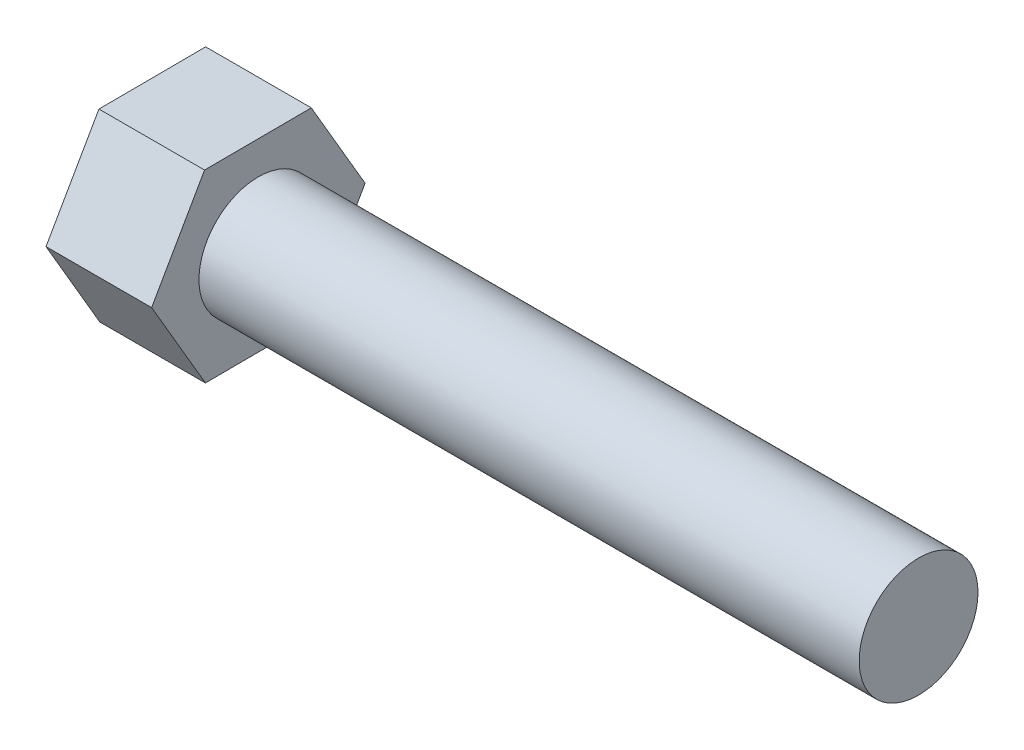
ISO-10303-21;
HEADER;
FILE_DESCRIPTION(('STEP AP214'),'2;1');
FILE_NAME('part.step','',(''),(''),'','','');
FILE_SCHEMA(('AUTOMOTIVE_DESIGN { 1 0 10303 214 1 1 1 1 }'));
ENDSEC;
DATA;
#1=APPLICATION_CONTEXT('core data for automotive mechanical design processes');
#2=APPLICATION_PROTOCOL_DEFINITION('international standard','automotive_design',2000,#1);
#3=PRODUCT_CONTEXT('',#1,'mechanical');
#4=PRODUCT('Part','Part','',(#3));
#5=PRODUCT_RELATED_PRODUCT_CATEGORY('part','',(#4));
#6=PRODUCT_DEFINITION_FORMATION('','',#4);
#7=PRODUCT_DEFINITION_CONTEXT('part definition',#1,'design');
#8=PRODUCT_DEFINITION('design','',#6,#7);
#9=PRODUCT_DEFINITION_SHAPE('','',#8);
#10=(LENGTH_UNIT() NAMED_UNIT(*) SI_UNIT(.MILLI.,.METRE.));
#11=(NAMED_UNIT(*) PLANE_ANGLE_UNIT() SI_UNIT($,.RADIAN.));
#12=(NAMED_UNIT(*) SI_UNIT($,.STERADIAN.) SOLID_ANGLE_UNIT());
#13=UNCERTAINTY_MEASURE_WITH_UNIT(LENGTH_MEASURE(1.E-05),#10,'distance_accuracy_value','');
#14=(GEOMETRIC_REPRESENTATION_CONTEXT(3) GLOBAL_UNCERTAINTY_ASSIGNED_CONTEXT((#13)) GLOBAL_UNIT_ASSIGNED_CONTEXT((#10,
#11,#12)) REPRESENTATION_CONTEXT('',''));
#15=CARTESIAN_POINT('',(0.,0.,0.));
#16=DIRECTION('',(0.,0.,1.));
#17=DIRECTION('',(1.,0.,0.));
#18=AXIS2_PLACEMENT_3D('',#15,#16,#17);
#19=CARTESIAN_POINT('',(4.,-3.50960525079608,2.00399708505724));
#20=DIRECTION('',(0.,0.999988608709094,0.00477309669411459));
#21=DIRECTION('',(0.,-0.00477309669411459,0.999988608709094));
#22=AXIS2_PLACEMENT_3D('',#19,#20,#21);
#23=PLANE('',#22);
#24=DIRECTION('',(0.,0.00477309669411459,-0.999988608709094));
#25=VECTOR('',#24,1.);
#26=CARTESIAN_POINT('',(0.,-3.50960525079608,2.00399708505724));
#27=LINE('',#26,#25);
#28=CARTESIAN_POINT('',(0.,-3.50960525079608,2.00399708505724));
#29=VERTEX_POINT('',#28);
#30=CARTESIAN_POINT('',(0.,-3.49031501016757,-2.03740876191604));
#31=VERTEX_POINT('',#30);
#32=EDGE_CURVE('E123',#29,#31,#27,.T.);
#33=ORIENTED_EDGE('',*,*,#32,.T.);
#34=DIRECTION('',(-1.,0.,0.));
#35=VECTOR('',#34,1.);
#36=CARTESIAN_POINT('',(4.,-3.49031501016757,-2.03740876191604));
#37=LINE('',#36,#35);
#38=CARTESIAN_POINT('',(4.,-3.49031501016757,-2.03740876191604));
#39=VERTEX_POINT('',#38);
#40=EDGE_CURVE('E40',#39,#31,#37,.T.);
#41=ORIENTED_EDGE('',*,*,#40,.F.);
#42=DIRECTION('',(0.,0.00477309669411459,-0.999988608709094));
#43=VECTOR('',#42,1.);
#44=CARTESIAN_POINT('',(4.,-3.50960525079608,2.00399708505724));
#45=LINE('',#44,#43);
#46=CARTESIAN_POINT('',(4.,-3.50960525079608,2.00399708505724));
#47=VERTEX_POINT('',#46);
#48=EDGE_CURVE('E134',#47,#39,#45,.T.);
#49=ORIENTED_EDGE('',*,*,#48,.F.);
#50=DIRECTION('',(-1.,0.,0.));
#51=VECTOR('',#50,1.);
#52=CARTESIAN_POINT('',(4.,-3.50960525079608,2.00399708505724));
#53=LINE('',#52,#51);
#54=EDGE_CURVE('E119',#47,#29,#53,.T.);
#55=ORIENTED_EDGE('',*,*,#54,.T.);
#56=EDGE_LOOP('',(#33,#41,#49,#55));
#57=FACE_BOUND('',#56,.T.);
#58=ADVANCED_FACE('F37',(#57),#23,.F.);
#59=CARTESIAN_POINT('',(4.,-3.49031501016757,-2.03740876191604));
#60=DIRECTION('',(0.,0.495860681362724,0.868402086984189));
#61=DIRECTION('',(0.,-0.868402086984189,0.495860681362724));
#62=AXIS2_PLACEMENT_3D('',#59,#60,#61);
#63=PLANE('',#62);
#64=DIRECTION('',(0.,0.868402086984189,-0.495860681362724));
#65=VECTOR('',#64,1.);
#66=CARTESIAN_POINT('',(0.,-3.49031501016757,-2.03740876191604));
#67=LINE('',#66,#65);
#68=CARTESIAN_POINT('',(0.,0.0192902406285058,-4.04140584697328));
#69=VERTEX_POINT('',#68);
#70=EDGE_CURVE('E126',#31,#69,#67,.T.);
#71=ORIENTED_EDGE('',*,*,#70,.T.);
#72=DIRECTION('',(-1.,0.,0.));
#73=VECTOR('',#72,1.);
#74=CARTESIAN_POINT('',(4.,0.0192902406285058,-4.04140584697328));
#75=LINE('',#74,#73);
#76=CARTESIAN_POINT('',(4.,0.0192902406285058,-4.04140584697328));
#77=VERTEX_POINT('',#76);
#78=EDGE_CURVE('E137',#77,#69,#75,.T.);
#79=ORIENTED_EDGE('',*,*,#78,.F.);
#80=DIRECTION('',(0.,0.868402086984189,-0.495860681362724));
#81=VECTOR('',#80,1.);
#82=CARTESIAN_POINT('',(4.,-3.49031501016757,-2.03740876191604));
#83=LINE('',#82,#81);
#84=EDGE_CURVE('E92',#39,#77,#83,.T.);
#85=ORIENTED_EDGE('',*,*,#84,.F.);
#86=ORIENTED_EDGE('',*,*,#40,.T.);
#87=EDGE_LOOP('',(#71,#79,#85,#86));
#88=FACE_BOUND('',#87,.T.);
#89=ADVANCED_FACE('F142',(#88),#63,.F.);
#90=CARTESIAN_POINT('',(4.,0.0192902406285058,-4.04140584697328));
#91=DIRECTION('',(0.,-0.504127927346369,0.863628990290075));
#92=DIRECTION('',(0.,-0.863628990290075,-0.504127927346369));
#93=AXIS2_PLACEMENT_3D('',#90,#91,#92);
#94=PLANE('',#93);
#95=DIRECTION('',(0.,0.863628990290075,0.504127927346369));
#96=VECTOR('',#95,1.);
#97=CARTESIAN_POINT('',(0.,0.0192902406285058,-4.04140584697328));
#98=LINE('',#97,#96);
#99=CARTESIAN_POINT('',(0.,3.50960525079608,-2.00399708505724));
#100=VERTEX_POINT('',#99);
#101=EDGE_CURVE('E129',#69,#100,#98,.T.);
#102=ORIENTED_EDGE('',*,*,#101,.T.);
#103=DIRECTION('',(-1.,0.,0.));
#104=VECTOR('',#103,1.);
#105=CARTESIAN_POINT('',(4.,3.50960525079608,-2.00399708505724));
#106=LINE('',#105,#104);
#107=CARTESIAN_POINT('',(4.,3.50960525079608,-2.00399708505724));
#108=VERTEX_POINT('',#107);
#109=EDGE_CURVE('E114',#108,#100,#106,.T.);
#110=ORIENTED_EDGE('',*,*,#109,.F.);
#111=DIRECTION('',(0.,0.863628990290075,0.504127927346369));
#112=VECTOR('',#111,1.);
#113=CARTESIAN_POINT('',(4.,0.0192902406285058,-4.04140584697328));
#114=LINE('',#113,#112);
#115=EDGE_CURVE('E105',#77,#108,#114,.T.);
#116=ORIENTED_EDGE('',*,*,#115,.F.);
#117=ORIENTED_EDGE('',*,*,#78,.T.);
#118=EDGE_LOOP('',(#102,#110,#116,#117));
#119=FACE_BOUND('',#118,.T.);
#120=ADVANCED_FACE('F148',(#119),#94,.F.);
#121=CARTESIAN_POINT('',(4.,3.50960525079608,-2.00399708505724));
#122=DIRECTION('',(0.,-0.999988608709094,-0.00477309669411416));
#123=DIRECTION('',(0.,0.00477309669411416,-0.999988608709094));
#124=AXIS2_PLACEMENT_3D('',#121,#122,#123);
#125=PLANE('',#124);
#126=DIRECTION('',(0.,-0.00477309669411416,0.999988608709094));
#127=VECTOR('',#126,1.);
#128=CARTESIAN_POINT('',(0.,3.50960525079608,-2.00399708505724));
#129=LINE('',#128,#127);
#130=CARTESIAN_POINT('',(0.,3.49031501016758,2.03740876191604));
#131=VERTEX_POINT('',#130);
#132=EDGE_CURVE('E113',#100,#131,#129,.T.);
#133=ORIENTED_EDGE('',*,*,#132,.T.);
#134=DIRECTION('',(-1.,0.,0.));
#135=VECTOR('',#134,1.);
#136=CARTESIAN_POINT('',(4.,3.49031501016758,2.03740876191604));
#137=LINE('',#136,#135);
#138=CARTESIAN_POINT('',(4.,3.49031501016758,2.03740876191604));
#139=VERTEX_POINT('',#138);
#140=EDGE_CURVE('E110',#139,#131,#137,.T.);
#141=ORIENTED_EDGE('',*,*,#140,.F.);
#142=DIRECTION('',(0.,-0.00477309669411416,0.999988608709094));
#143=VECTOR('',#142,1.);
#144=CARTESIAN_POINT('',(4.,3.50960525079608,-2.00399708505724));
#145=LINE('',#144,#143);
#146=EDGE_CURVE('E99',#108,#139,#145,.T.);
#147=ORIENTED_EDGE('',*,*,#146,.F.);
#148=ORIENTED_EDGE('',*,*,#109,.T.);
#149=EDGE_LOOP('',(#133,#141,#147,#148));
#150=FACE_BOUND('',#149,.T.);
#151=ADVANCED_FACE('F111',(#150),#125,.F.);
#152=CARTESIAN_POINT('',(4.,3.49031501016758,2.03740876191604));
#153=DIRECTION('',(0.,-0.495860681362724,-0.868402086984189));
#154=DIRECTION('',(0.,0.868402086984189,-0.495860681362724));
#155=AXIS2_PLACEMENT_3D('',#152,#153,#154);
#156=PLANE('',#155);
#157=DIRECTION('',(0.,-0.868402086984189,0.495860681362724));
#158=VECTOR('',#157,1.);
#159=CARTESIAN_POINT('',(0.,3.49031501016758,2.03740876191604));
#160=LINE('',#159,#158);
#161=CARTESIAN_POINT('',(0.,-0.0192902406285045,4.04140584697328));
#162=VERTEX_POINT('',#161);
#163=EDGE_CURVE('E77',#131,#162,#160,.T.);
#164=ORIENTED_EDGE('',*,*,#163,.T.);
#165=DIRECTION('',(-1.,0.,0.));
#166=VECTOR('',#165,1.);
#167=CARTESIAN_POINT('',(4.,-0.0192902406285045,4.04140584697328));
#168=LINE('',#167,#166);
#169=CARTESIAN_POINT('',(4.,-0.0192902406285045,4.04140584697328));
#170=VERTEX_POINT('',#169);
#171=EDGE_CURVE('E115',#170,#162,#168,.T.);
#172=ORIENTED_EDGE('',*,*,#171,.F.);
#173=DIRECTION('',(0.,-0.868402086984189,0.495860681362724));
#174=VECTOR('',#173,1.);
#175=CARTESIAN_POINT('',(4.,3.49031501016758,2.03740876191604));
#176=LINE('',#175,#174);
#177=EDGE_CURVE('E103',#139,#170,#176,.T.);
#178=ORIENTED_EDGE('',*,*,#177,.F.);
#179=ORIENTED_EDGE('',*,*,#140,.T.);
#180=EDGE_LOOP('',(#164,#172,#178,#179));
#181=FACE_BOUND('',#180,.T.);
#182=ADVANCED_FACE('F117',(#181),#156,.F.);
#183=CARTESIAN_POINT('',(4.,-0.0192902406285045,4.04140584697328));
#184=DIRECTION('',(0.,0.504127927346369,-0.863628990290075));
#185=DIRECTION('',(0.,0.863628990290075,0.504127927346369));
#186=AXIS2_PLACEMENT_3D('',#183,#184,#185);
#187=PLANE('',#186);
#188=DIRECTION('',(0.,-0.863628990290075,-0.504127927346369));
#189=VECTOR('',#188,1.);
#190=CARTESIAN_POINT('',(0.,-0.0192902406285045,4.04140584697328));
#191=LINE('',#190,#189);
#192=EDGE_CURVE('E83',#162,#29,#191,.T.);
#193=ORIENTED_EDGE('',*,*,#192,.T.);
#194=ORIENTED_EDGE('',*,*,#54,.F.);
#195=DIRECTION('',(0.,-0.863628990290075,-0.504127927346369));
#196=VECTOR('',#195,1.);
#197=CARTESIAN_POINT('',(4.,-0.0192902406285045,4.04140584697328));
#198=LINE('',#197,#196);
#199=EDGE_CURVE('E54',#170,#47,#198,.T.);
#200=ORIENTED_EDGE('',*,*,#199,.F.);
#201=ORIENTED_EDGE('',*,*,#171,.T.);
#202=EDGE_LOOP('',(#193,#194,#200,#201));
#203=FACE_BOUND('',#202,.T.);
#204=ADVANCED_FACE('F164',(#203),#187,.F.);
#205=CARTESIAN_POINT('',(4.,0.,0.));
#206=DIRECTION('',(1.,0.,0.));
#207=DIRECTION('',(0.,0.,-1.));
#208=AXIS2_PLACEMENT_3D('',#205,#206,#207);
#209=PLANE('',#208);
#210=CARTESIAN_POINT('',(4.,0.,0.));
#211=DIRECTION('',(1.,0.,0.));
#212=DIRECTION('',(0.,0.,-1.));
#213=AXIS2_PLACEMENT_3D('',#210,#211,#212);
#214=CIRCLE('',#213,2.25);
#215=CARTESIAN_POINT('',(4.,0.,-2.25));
#216=VERTEX_POINT('',#215);
#217=EDGE_CURVE('E11',#216,#216,#214,.T.);
#218=ORIENTED_EDGE('',*,*,#217,.F.);
#219=EDGE_LOOP('',(#218));
#220=FACE_BOUND('',#219,.T.);
#221=ORIENTED_EDGE('',*,*,#48,.T.);
#222=ORIENTED_EDGE('',*,*,#84,.T.);
#223=ORIENTED_EDGE('',*,*,#115,.T.);
#224=ORIENTED_EDGE('',*,*,#146,.T.);
#225=ORIENTED_EDGE('',*,*,#177,.T.);
#226=ORIENTED_EDGE('',*,*,#199,.T.);
#227=EDGE_LOOP('',(#221,#222,#223,#224,#225,#226));
#228=FACE_BOUND('',#227,.T.);
#229=ADVANCED_FACE('F101',(#220,#228),#209,.T.);
#230=CARTESIAN_POINT('',(0.,0.,0.));
#231=DIRECTION('',(1.,0.,0.));
#232=DIRECTION('',(0.,0.,-1.));
#233=AXIS2_PLACEMENT_3D('',#230,#231,#232);
#234=PLANE('',#233);
#235=ORIENTED_EDGE('',*,*,#32,.F.);
#236=ORIENTED_EDGE('',*,*,#192,.F.);
#237=ORIENTED_EDGE('',*,*,#163,.F.);
#238=ORIENTED_EDGE('',*,*,#132,.F.);
#239=ORIENTED_EDGE('',*,*,#101,.F.);
#240=ORIENTED_EDGE('',*,*,#70,.F.);
#241=EDGE_LOOP('',(#235,#236,#237,#238,#239,#240));
#242=FACE_BOUND('',#241,.T.);
#243=ADVANCED_FACE('F147',(#242),#234,.F.);
#244=CARTESIAN_POINT('',(29.,0.,0.));
#245=DIRECTION('',(-1.,0.,0.));
#246=DIRECTION('',(0.,0.,1.));
#247=AXIS2_PLACEMENT_3D('',#244,#245,#246);
#248=CYLINDRICAL_SURFACE('',#247,2.25);
#249=CARTESIAN_POINT('',(29.,0.,0.));
#250=DIRECTION('',(1.,0.,0.));
#251=DIRECTION('',(0.,0.,-1.));
#252=AXIS2_PLACEMENT_3D('',#249,#250,#251);
#253=CIRCLE('',#252,2.25);
#254=CARTESIAN_POINT('',(29.,0.,-2.25));
#255=VERTEX_POINT('',#254);
#256=EDGE_CURVE('E127',#255,#255,#253,.T.);
#257=ORIENTED_EDGE('',*,*,#256,.F.);
#258=EDGE_LOOP('',(#257));
#259=FACE_BOUND('',#258,.T.);
#260=ORIENTED_EDGE('',*,*,#217,.T.);
#261=EDGE_LOOP('',(#260));
#262=FACE_BOUND('',#261,.T.);
#263=ADVANCED_FACE('F157',(#259,#262),#248,.T.);
#264=CARTESIAN_POINT('',(29.,0.,0.));
#265=DIRECTION('',(1.,0.,0.));
#266=DIRECTION('',(0.,0.,-1.));
#267=AXIS2_PLACEMENT_3D('',#264,#265,#266);
#268=PLANE('',#267);
#269=ORIENTED_EDGE('',*,*,#256,.T.);
#270=EDGE_LOOP('',(#269));
#271=FACE_BOUND('',#270,.T.);
#272=ADVANCED_FACE('F155',(#271),#268,.T.);
#273=CLOSED_SHELL('',(#58,#89,#120,#151,#182,#204,#229,#243,#263,#272));
#274=MANIFOLD_SOLID_BREP('B2',#273);
#275=ADVANCED_BREP_SHAPE_REPRESENTATION('',(#18,#274),#14);
#276=SHAPE_DEFINITION_REPRESENTATION(#9,#275);
ENDSEC;
END-ISO-10303-21;
